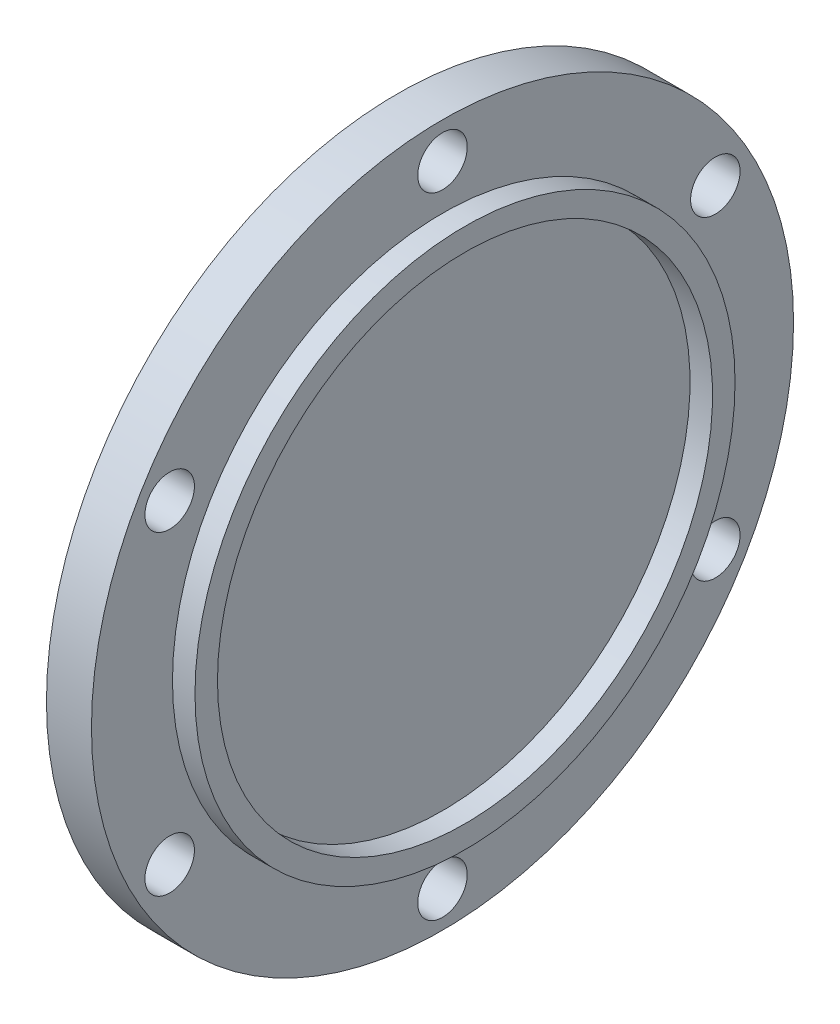
ISO-10303-21;
HEADER;
FILE_DESCRIPTION(('STEP AP214'),'2;1');
FILE_NAME('part.step','',(''),(''),'','','');
FILE_SCHEMA(('AUTOMOTIVE_DESIGN { 1 0 10303 214 1 1 1 1 }'));
ENDSEC;
DATA;
#1=APPLICATION_CONTEXT('core data for automotive mechanical design processes');
#2=APPLICATION_PROTOCOL_DEFINITION('international standard','automotive_design',2000,#1);
#3=PRODUCT_CONTEXT('',#1,'mechanical');
#4=PRODUCT('Part','Part','',(#3));
#5=PRODUCT_RELATED_PRODUCT_CATEGORY('part','',(#4));
#6=PRODUCT_DEFINITION_FORMATION('','',#4);
#7=PRODUCT_DEFINITION_CONTEXT('part definition',#1,'design');
#8=PRODUCT_DEFINITION('design','',#6,#7);
#9=PRODUCT_DEFINITION_SHAPE('','',#8);
#10=(LENGTH_UNIT() NAMED_UNIT(*) SI_UNIT(.MILLI.,.METRE.));
#11=(NAMED_UNIT(*) PLANE_ANGLE_UNIT() SI_UNIT($,.RADIAN.));
#12=(NAMED_UNIT(*) SI_UNIT($,.STERADIAN.) SOLID_ANGLE_UNIT());
#13=UNCERTAINTY_MEASURE_WITH_UNIT(LENGTH_MEASURE(1.E-05),#10,'distance_accuracy_value','');
#14=(GEOMETRIC_REPRESENTATION_CONTEXT(3) GLOBAL_UNCERTAINTY_ASSIGNED_CONTEXT((#13)) GLOBAL_UNIT_ASSIGNED_CONTEXT((#10,
#11,#12)) REPRESENTATION_CONTEXT('',''));
#15=CARTESIAN_POINT('',(0.,0.,0.));
#16=DIRECTION('',(0.,0.,1.));
#17=DIRECTION('',(1.,0.,0.));
#18=AXIS2_PLACEMENT_3D('',#15,#16,#17);
#19=CARTESIAN_POINT('',(10.,60.,0.));
#20=DIRECTION('',(-1.,0.,0.));
#21=DIRECTION('',(0.,0.,1.));
#22=AXIS2_PLACEMENT_3D('',#19,#20,#21);
#23=PLANE('',#22);
#24=CARTESIAN_POINT('',(10.,-35.0000000000001,-60.6217782649107));
#25=DIRECTION('',(1.,0.,0.));
#26=DIRECTION('',(0.,-0.86602540378444,-0.499999999999998));
#27=AXIS2_PLACEMENT_3D('',#24,#25,#26);
#28=CIRCLE('',#27,5.5);
#29=CARTESIAN_POINT('',(10.,-39.7631397208145,-63.3717782649107));
#30=VERTEX_POINT('',#29);
#31=EDGE_CURVE('E66',#30,#30,#28,.T.);
#32=ORIENTED_EDGE('',*,*,#31,.F.);
#33=EDGE_LOOP('',(#32));
#34=FACE_BOUND('',#33,.T.);
#35=CARTESIAN_POINT('',(10.,-70.,2.28983498828939E-13));
#36=DIRECTION('',(1.,0.,0.));
#37=DIRECTION('',(0.,-0.866025403784436,0.500000000000004));
#38=AXIS2_PLACEMENT_3D('',#35,#36,#37);
#39=CIRCLE('',#38,5.5);
#40=CARTESIAN_POINT('',(10.,-74.7631397208144,2.75000000000025));
#41=VERTEX_POINT('',#40);
#42=EDGE_CURVE('E132',#41,#41,#39,.T.);
#43=ORIENTED_EDGE('',*,*,#42,.F.);
#44=EDGE_LOOP('',(#43));
#45=FACE_BOUND('',#44,.T.);
#46=CARTESIAN_POINT('',(10.,-35.0000000000001,60.6217782649107));
#47=DIRECTION('',(1.,0.,0.));
#48=DIRECTION('',(0.,0.,1.));
#49=AXIS2_PLACEMENT_3D('',#46,#47,#48);
#50=CIRCLE('',#49,5.5);
#51=CARTESIAN_POINT('',(10.,-35.0000000000001,66.1217782649107));
#52=VERTEX_POINT('',#51);
#53=EDGE_CURVE('E136',#52,#52,#50,.T.);
#54=ORIENTED_EDGE('',*,*,#53,.F.);
#55=EDGE_LOOP('',(#54));
#56=FACE_BOUND('',#55,.T.);
#57=CARTESIAN_POINT('',(10.,35.0000000000005,60.6217782649104));
#58=DIRECTION('',(1.,0.,0.));
#59=DIRECTION('',(0.,0.866025403784443,0.499999999999992));
#60=AXIS2_PLACEMENT_3D('',#57,#58,#59);
#61=CIRCLE('',#60,5.5);
#62=CARTESIAN_POINT('',(10.,39.7631397208149,63.3717782649104));
#63=VERTEX_POINT('',#62);
#64=EDGE_CURVE('E140',#63,#63,#61,.T.);
#65=ORIENTED_EDGE('',*,*,#64,.F.);
#66=EDGE_LOOP('',(#65));
#67=FACE_BOUND('',#66,.T.);
#68=CARTESIAN_POINT('',(10.,70.,-7.21644966006352E-13));
#69=DIRECTION('',(1.,0.,0.));
#70=DIRECTION('',(0.,0.866025403784433,-0.50000000000001));
#71=AXIS2_PLACEMENT_3D('',#68,#69,#70);
#72=CIRCLE('',#71,5.5);
#73=CARTESIAN_POINT('',(10.,74.7631397208144,-2.75000000000078));
#74=VERTEX_POINT('',#73);
#75=EDGE_CURVE('E89',#74,#74,#72,.T.);
#76=ORIENTED_EDGE('',*,*,#75,.F.);
#77=EDGE_LOOP('',(#76));
#78=FACE_BOUND('',#77,.T.);
#79=CARTESIAN_POINT('',(10.,35.0000000000001,-60.6217782649107));
#80=DIRECTION('',(1.,0.,0.));
#81=DIRECTION('',(0.,0.,-1.));
#82=AXIS2_PLACEMENT_3D('',#79,#80,#81);
#83=CIRCLE('',#82,5.5);
#84=CARTESIAN_POINT('',(10.,35.0000000000001,-66.1217782649107));
#85=VERTEX_POINT('',#84);
#86=EDGE_CURVE('E60',#85,#85,#83,.T.);
#87=ORIENTED_EDGE('',*,*,#86,.F.);
#88=EDGE_LOOP('',(#87));
#89=FACE_BOUND('',#88,.T.);
#90=CARTESIAN_POINT('',(9.99999999999999,0.,0.));
#91=DIRECTION('',(-1.,0.,0.));
#92=DIRECTION('',(0.,0.,1.));
#93=AXIS2_PLACEMENT_3D('',#90,#91,#92);
#94=CIRCLE('',#93,78.);
#95=CARTESIAN_POINT('',(9.99999999999999,0.,78.));
#96=VERTEX_POINT('',#95);
#97=EDGE_CURVE('E10',#96,#96,#94,.T.);
#98=ORIENTED_EDGE('',*,*,#97,.F.);
#99=EDGE_LOOP('',(#98));
#100=FACE_BOUND('',#99,.T.);
#101=CARTESIAN_POINT('',(10.,0.,0.));
#102=DIRECTION('',(-1.,0.,0.));
#103=DIRECTION('',(0.,0.,1.));
#104=AXIS2_PLACEMENT_3D('',#101,#102,#103);
#105=CIRCLE('',#104,60.);
#106=CARTESIAN_POINT('',(10.,0.,60.));
#107=VERTEX_POINT('',#106);
#108=EDGE_CURVE('E59',#107,#107,#105,.T.);
#109=ORIENTED_EDGE('',*,*,#108,.T.);
#110=EDGE_LOOP('',(#109));
#111=FACE_BOUND('',#110,.T.);
#112=ADVANCED_FACE('F37',(#34,#45,#56,#67,#78,#89,#100,#111),#23,.F.);
#113=CARTESIAN_POINT('',(0.,0.,0.));
#114=DIRECTION('',(-1.,0.,0.));
#115=DIRECTION('',(0.,0.,1.));
#116=AXIS2_PLACEMENT_3D('',#113,#114,#115);
#117=CYLINDRICAL_SURFACE('',#116,78.);
#118=CARTESIAN_POINT('',(0.,0.,0.));
#119=DIRECTION('',(-1.,0.,0.));
#120=DIRECTION('',(0.,0.,1.));
#121=AXIS2_PLACEMENT_3D('',#118,#119,#120);
#122=CIRCLE('',#121,78.);
#123=CARTESIAN_POINT('',(0.,0.,78.));
#124=VERTEX_POINT('',#123);
#125=EDGE_CURVE('E45',#124,#124,#122,.T.);
#126=ORIENTED_EDGE('',*,*,#125,.F.);
#127=EDGE_LOOP('',(#126));
#128=FACE_BOUND('',#127,.T.);
#129=ORIENTED_EDGE('',*,*,#97,.T.);
#130=EDGE_LOOP('',(#129));
#131=FACE_BOUND('',#130,.T.);
#132=ADVANCED_FACE('F118',(#128,#131),#117,.T.);
#133=CARTESIAN_POINT('',(0.,78.,0.));
#134=DIRECTION('',(1.,0.,0.));
#135=DIRECTION('',(0.,0.,-1.));
#136=AXIS2_PLACEMENT_3D('',#133,#134,#135);
#137=PLANE('',#136);
#138=CARTESIAN_POINT('',(0.,-35.0000000000001,-60.6217782649107));
#139=DIRECTION('',(1.,0.,0.));
#140=DIRECTION('',(0.,0.,-1.));
#141=AXIS2_PLACEMENT_3D('',#138,#139,#140);
#142=CIRCLE('',#141,5.5);
#143=CARTESIAN_POINT('',(0.,-35.0000000000001,-66.1217782649107));
#144=VERTEX_POINT('',#143);
#145=EDGE_CURVE('E40',#144,#144,#142,.T.);
#146=ORIENTED_EDGE('',*,*,#145,.T.);
#147=EDGE_LOOP('',(#146));
#148=FACE_BOUND('',#147,.T.);
#149=CARTESIAN_POINT('',(0.,-70.,2.28983498828939E-13));
#150=DIRECTION('',(1.,0.,0.));
#151=DIRECTION('',(0.,0.,-1.));
#152=AXIS2_PLACEMENT_3D('',#149,#150,#151);
#153=CIRCLE('',#152,5.5);
#154=CARTESIAN_POINT('',(0.,-70.,-5.49999999999978));
#155=VERTEX_POINT('',#154);
#156=EDGE_CURVE('E73',#155,#155,#153,.T.);
#157=ORIENTED_EDGE('',*,*,#156,.T.);
#158=EDGE_LOOP('',(#157));
#159=FACE_BOUND('',#158,.T.);
#160=CARTESIAN_POINT('',(0.,-35.0000000000001,60.6217782649107));
#161=DIRECTION('',(1.,0.,0.));
#162=DIRECTION('',(0.,0.,-1.));
#163=AXIS2_PLACEMENT_3D('',#160,#161,#162);
#164=CIRCLE('',#163,5.5);
#165=CARTESIAN_POINT('',(0.,-35.0000000000001,55.1217782649107));
#166=VERTEX_POINT('',#165);
#167=EDGE_CURVE('E70',#166,#166,#164,.T.);
#168=ORIENTED_EDGE('',*,*,#167,.T.);
#169=EDGE_LOOP('',(#168));
#170=FACE_BOUND('',#169,.T.);
#171=CARTESIAN_POINT('',(0.,35.0000000000005,60.6217782649104));
#172=DIRECTION('',(1.,0.,0.));
#173=DIRECTION('',(0.,0.,-1.));
#174=AXIS2_PLACEMENT_3D('',#171,#172,#173);
#175=CIRCLE('',#174,5.5);
#176=CARTESIAN_POINT('',(0.,35.0000000000005,55.1217782649104));
#177=VERTEX_POINT('',#176);
#178=EDGE_CURVE('E65',#177,#177,#175,.T.);
#179=ORIENTED_EDGE('',*,*,#178,.T.);
#180=EDGE_LOOP('',(#179));
#181=FACE_BOUND('',#180,.T.);
#182=CARTESIAN_POINT('',(0.,70.,-7.21644966006352E-13));
#183=DIRECTION('',(1.,0.,0.));
#184=DIRECTION('',(0.,0.,-1.));
#185=AXIS2_PLACEMENT_3D('',#182,#183,#184);
#186=CIRCLE('',#185,5.5);
#187=CARTESIAN_POINT('',(0.,70.,-5.50000000000073));
#188=VERTEX_POINT('',#187);
#189=EDGE_CURVE('E61',#188,#188,#186,.T.);
#190=ORIENTED_EDGE('',*,*,#189,.T.);
#191=EDGE_LOOP('',(#190));
#192=FACE_BOUND('',#191,.T.);
#193=CARTESIAN_POINT('',(0.,35.0000000000001,-60.6217782649107));
#194=DIRECTION('',(1.,0.,0.));
#195=DIRECTION('',(0.,0.,-1.));
#196=AXIS2_PLACEMENT_3D('',#193,#194,#195);
#197=CIRCLE('',#196,5.5);
#198=CARTESIAN_POINT('',(0.,35.0000000000001,-66.1217782649107));
#199=VERTEX_POINT('',#198);
#200=EDGE_CURVE('E55',#199,#199,#197,.T.);
#201=ORIENTED_EDGE('',*,*,#200,.T.);
#202=EDGE_LOOP('',(#201));
#203=FACE_BOUND('',#202,.T.);
#204=ORIENTED_EDGE('',*,*,#125,.T.);
#205=EDGE_LOOP('',(#204));
#206=FACE_BOUND('',#205,.T.);
#207=ADVANCED_FACE('F109',(#148,#159,#170,#181,#192,#203,#206),#137,.F.);
#208=CARTESIAN_POINT('',(10.,0.,0.));
#209=DIRECTION('',(-1.,0.,0.));
#210=DIRECTION('',(0.,0.,1.));
#211=AXIS2_PLACEMENT_3D('',#208,#209,#210);
#212=PLANE('',#211);
#213=CARTESIAN_POINT('',(10.,0.,0.));
#214=DIRECTION('',(-1.,0.,0.));
#215=DIRECTION('',(0.,0.,1.));
#216=AXIS2_PLACEMENT_3D('',#213,#214,#215);
#217=CIRCLE('',#216,55.);
#218=CARTESIAN_POINT('',(10.,0.,55.));
#219=VERTEX_POINT('',#218);
#220=EDGE_CURVE('E51',#219,#219,#217,.T.);
#221=ORIENTED_EDGE('',*,*,#220,.F.);
#222=EDGE_LOOP('',(#221));
#223=FACE_BOUND('',#222,.T.);
#224=ADVANCED_FACE('F107',(#223),#212,.F.);
#225=CARTESIAN_POINT('',(0.,0.,0.));
#226=DIRECTION('',(-1.,0.,0.));
#227=DIRECTION('',(0.,0.,1.));
#228=AXIS2_PLACEMENT_3D('',#225,#226,#227);
#229=CYLINDRICAL_SURFACE('',#228,55.);
#230=CARTESIAN_POINT('',(15.,0.,0.));
#231=DIRECTION('',(-1.,0.,0.));
#232=DIRECTION('',(0.,0.,1.));
#233=AXIS2_PLACEMENT_3D('',#230,#231,#232);
#234=CIRCLE('',#233,55.);
#235=CARTESIAN_POINT('',(15.,0.,55.));
#236=VERTEX_POINT('',#235);
#237=EDGE_CURVE('E98',#236,#236,#234,.T.);
#238=ORIENTED_EDGE('',*,*,#237,.F.);
#239=EDGE_LOOP('',(#238));
#240=FACE_BOUND('',#239,.T.);
#241=ORIENTED_EDGE('',*,*,#220,.T.);
#242=EDGE_LOOP('',(#241));
#243=FACE_BOUND('',#242,.T.);
#244=ADVANCED_FACE('F105',(#240,#243),#229,.F.);
#245=CARTESIAN_POINT('',(15.,55.,0.));
#246=DIRECTION('',(-1.,0.,0.));
#247=DIRECTION('',(0.,0.,1.));
#248=AXIS2_PLACEMENT_3D('',#245,#246,#247);
#249=PLANE('',#248);
#250=CARTESIAN_POINT('',(15.,0.,0.));
#251=DIRECTION('',(-1.,0.,0.));
#252=DIRECTION('',(0.,0.,1.));
#253=AXIS2_PLACEMENT_3D('',#250,#251,#252);
#254=CIRCLE('',#253,60.);
#255=CARTESIAN_POINT('',(15.,0.,60.));
#256=VERTEX_POINT('',#255);
#257=EDGE_CURVE('E94',#256,#256,#254,.T.);
#258=ORIENTED_EDGE('',*,*,#257,.F.);
#259=EDGE_LOOP('',(#258));
#260=FACE_BOUND('',#259,.T.);
#261=ORIENTED_EDGE('',*,*,#237,.T.);
#262=EDGE_LOOP('',(#261));
#263=FACE_BOUND('',#262,.T.);
#264=ADVANCED_FACE('F115',(#260,#263),#249,.F.);
#265=CARTESIAN_POINT('',(0.,0.,0.));
#266=DIRECTION('',(-1.,0.,0.));
#267=DIRECTION('',(0.,0.,1.));
#268=AXIS2_PLACEMENT_3D('',#265,#266,#267);
#269=CYLINDRICAL_SURFACE('',#268,60.);
#270=ORIENTED_EDGE('',*,*,#108,.F.);
#271=EDGE_LOOP('',(#270));
#272=FACE_BOUND('',#271,.T.);
#273=ORIENTED_EDGE('',*,*,#257,.T.);
#274=EDGE_LOOP('',(#273));
#275=FACE_BOUND('',#274,.T.);
#276=ADVANCED_FACE('F148',(#272,#275),#269,.T.);
#277=CARTESIAN_POINT('',(-10.,35.0000000000001,-60.6217782649107));
#278=DIRECTION('',(1.,0.,0.));
#279=DIRECTION('',(0.,0.,-1.));
#280=AXIS2_PLACEMENT_3D('',#277,#278,#279);
#281=CYLINDRICAL_SURFACE('',#280,5.5);
#282=ORIENTED_EDGE('',*,*,#86,.T.);
#283=EDGE_LOOP('',(#282));
#284=FACE_BOUND('',#283,.T.);
#285=ORIENTED_EDGE('',*,*,#200,.F.);
#286=EDGE_LOOP('',(#285));
#287=FACE_BOUND('',#286,.T.);
#288=ADVANCED_FACE('F151',(#284,#287),#281,.F.);
#289=CARTESIAN_POINT('',(-10.,70.,-7.21644966006352E-13));
#290=DIRECTION('',(1.,0.,0.));
#291=DIRECTION('',(0.,0.,-1.));
#292=AXIS2_PLACEMENT_3D('',#289,#290,#291);
#293=CYLINDRICAL_SURFACE('',#292,5.5);
#294=ORIENTED_EDGE('',*,*,#75,.T.);
#295=EDGE_LOOP('',(#294));
#296=FACE_BOUND('',#295,.T.);
#297=ORIENTED_EDGE('',*,*,#189,.F.);
#298=EDGE_LOOP('',(#297));
#299=FACE_BOUND('',#298,.T.);
#300=ADVANCED_FACE('F164',(#296,#299),#293,.F.);
#301=CARTESIAN_POINT('',(-10.,35.0000000000005,60.6217782649104));
#302=DIRECTION('',(1.,0.,0.));
#303=DIRECTION('',(0.,0.,-1.));
#304=AXIS2_PLACEMENT_3D('',#301,#302,#303);
#305=CYLINDRICAL_SURFACE('',#304,5.5);
#306=ORIENTED_EDGE('',*,*,#64,.T.);
#307=EDGE_LOOP('',(#306));
#308=FACE_BOUND('',#307,.T.);
#309=ORIENTED_EDGE('',*,*,#178,.F.);
#310=EDGE_LOOP('',(#309));
#311=FACE_BOUND('',#310,.T.);
#312=ADVANCED_FACE('F167',(#308,#311),#305,.F.);
#313=CARTESIAN_POINT('',(-10.,-35.0000000000001,60.6217782649107));
#314=DIRECTION('',(1.,0.,0.));
#315=DIRECTION('',(0.,0.,-1.));
#316=AXIS2_PLACEMENT_3D('',#313,#314,#315);
#317=CYLINDRICAL_SURFACE('',#316,5.5);
#318=ORIENTED_EDGE('',*,*,#53,.T.);
#319=EDGE_LOOP('',(#318));
#320=FACE_BOUND('',#319,.T.);
#321=ORIENTED_EDGE('',*,*,#167,.F.);
#322=EDGE_LOOP('',(#321));
#323=FACE_BOUND('',#322,.T.);
#324=ADVANCED_FACE('F171',(#320,#323),#317,.F.);
#325=CARTESIAN_POINT('',(-10.,-70.,2.28983498828939E-13));
#326=DIRECTION('',(1.,0.,0.));
#327=DIRECTION('',(0.,0.,-1.));
#328=AXIS2_PLACEMENT_3D('',#325,#326,#327);
#329=CYLINDRICAL_SURFACE('',#328,5.5);
#330=ORIENTED_EDGE('',*,*,#42,.T.);
#331=EDGE_LOOP('',(#330));
#332=FACE_BOUND('',#331,.T.);
#333=ORIENTED_EDGE('',*,*,#156,.F.);
#334=EDGE_LOOP('',(#333));
#335=FACE_BOUND('',#334,.T.);
#336=ADVANCED_FACE('F175',(#332,#335),#329,.F.);
#337=CARTESIAN_POINT('',(-10.,-35.0000000000001,-60.6217782649107));
#338=DIRECTION('',(1.,0.,0.));
#339=DIRECTION('',(0.,0.,-1.));
#340=AXIS2_PLACEMENT_3D('',#337,#338,#339);
#341=CYLINDRICAL_SURFACE('',#340,5.5);
#342=ORIENTED_EDGE('',*,*,#31,.T.);
#343=EDGE_LOOP('',(#342));
#344=FACE_BOUND('',#343,.T.);
#345=ORIENTED_EDGE('',*,*,#145,.F.);
#346=EDGE_LOOP('',(#345));
#347=FACE_BOUND('',#346,.T.);
#348=ADVANCED_FACE('F179',(#344,#347),#341,.F.);
#349=CLOSED_SHELL('',(#112,#132,#207,#224,#244,#264,#276,#288,#300,#312,#324,#336,#348));
#350=MANIFOLD_SOLID_BREP('B2',#349);
#351=ADVANCED_BREP_SHAPE_REPRESENTATION('',(#18,#350),#14);
#352=SHAPE_DEFINITION_REPRESENTATION(#9,#351);
ENDSEC;
END-ISO-10303-21;
